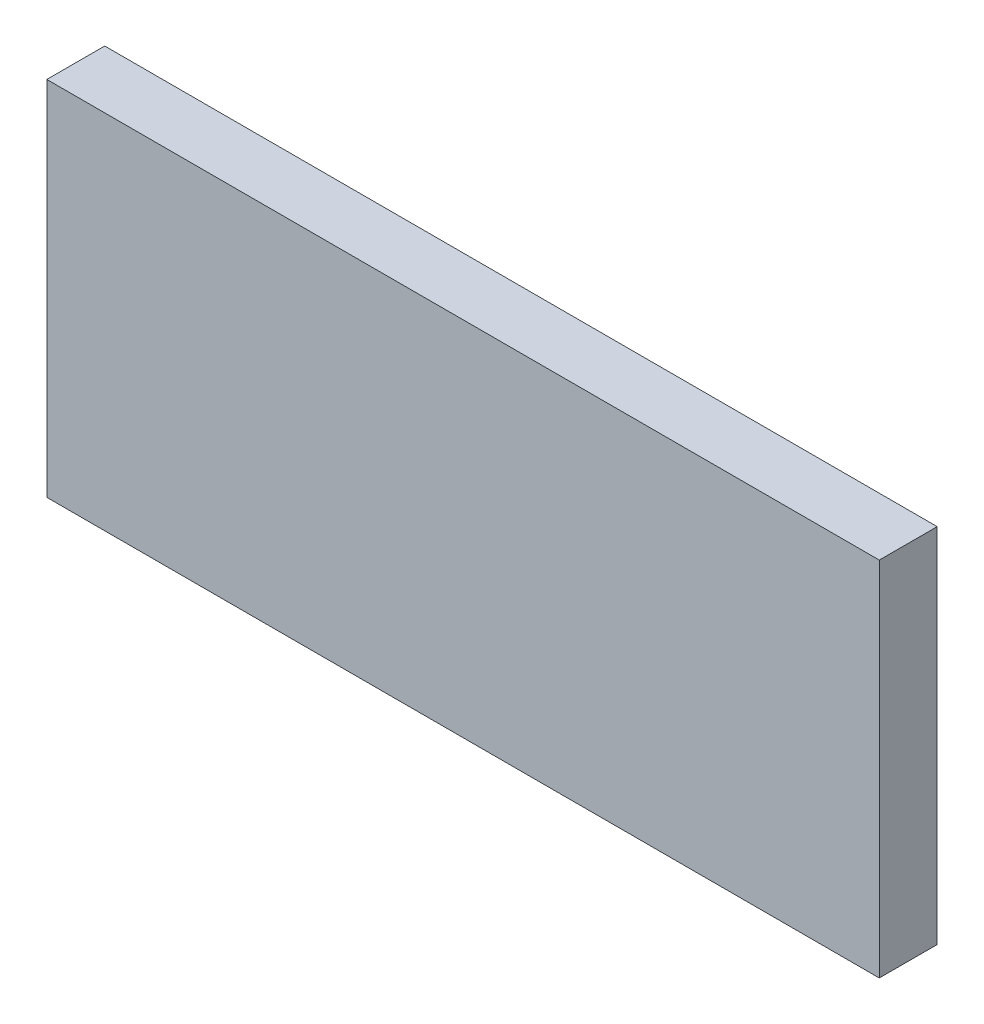
ISO-10303-21;
HEADER;
FILE_DESCRIPTION(('STEP AP214'),'2;1');
FILE_NAME('part.step','',(''),(''),'','','');
FILE_SCHEMA(('AUTOMOTIVE_DESIGN { 1 0 10303 214 1 1 1 1 }'));
ENDSEC;
DATA;
#1=APPLICATION_CONTEXT('core data for automotive mechanical design processes');
#2=APPLICATION_PROTOCOL_DEFINITION('international standard','automotive_design',2000,#1);
#3=PRODUCT_CONTEXT('',#1,'mechanical');
#4=PRODUCT('Part','Part','',(#3));
#5=PRODUCT_RELATED_PRODUCT_CATEGORY('part','',(#4));
#6=PRODUCT_DEFINITION_FORMATION('','',#4);
#7=PRODUCT_DEFINITION_CONTEXT('part definition',#1,'design');
#8=PRODUCT_DEFINITION('design','',#6,#7);
#9=PRODUCT_DEFINITION_SHAPE('','',#8);
#10=(LENGTH_UNIT() NAMED_UNIT(*) SI_UNIT(.MILLI.,.METRE.));
#11=(NAMED_UNIT(*) PLANE_ANGLE_UNIT() SI_UNIT($,.RADIAN.));
#12=(NAMED_UNIT(*) SI_UNIT($,.STERADIAN.) SOLID_ANGLE_UNIT());
#13=UNCERTAINTY_MEASURE_WITH_UNIT(LENGTH_MEASURE(1.E-05),#10,'distance_accuracy_value','');
#14=(GEOMETRIC_REPRESENTATION_CONTEXT(3) GLOBAL_UNCERTAINTY_ASSIGNED_CONTEXT((#13)) GLOBAL_UNIT_ASSIGNED_CONTEXT((#10,
#11,#12)) REPRESENTATION_CONTEXT('',''));
#15=CARTESIAN_POINT('',(0.,0.,0.));
#16=DIRECTION('',(0.,0.,1.));
#17=DIRECTION('',(1.,0.,0.));
#18=AXIS2_PLACEMENT_3D('',#15,#16,#17);
#19=CARTESIAN_POINT('',(-115.,-50.,16.));
#20=DIRECTION('',(1.,0.,0.));
#21=DIRECTION('',(0.,0.,-1.));
#22=AXIS2_PLACEMENT_3D('',#19,#20,#21);
#23=PLANE('',#22);
#24=DIRECTION('',(0.,-1.,0.));
#25=VECTOR('',#24,1.);
#26=CARTESIAN_POINT('',(-115.,-50.,0.));
#27=LINE('',#26,#25);
#28=CARTESIAN_POINT('',(-115.,50.,0.));
#29=VERTEX_POINT('',#28);
#30=CARTESIAN_POINT('',(-115.,-50.,0.));
#31=VERTEX_POINT('',#30);
#32=EDGE_CURVE('E98',#29,#31,#27,.T.);
#33=ORIENTED_EDGE('',*,*,#32,.T.);
#34=DIRECTION('',(0.,0.,-1.));
#35=VECTOR('',#34,1.);
#36=CARTESIAN_POINT('',(-115.,-50.,16.));
#37=LINE('',#36,#35);
#38=CARTESIAN_POINT('',(-115.,-50.,16.));
#39=VERTEX_POINT('',#38);
#40=EDGE_CURVE('E11',#39,#31,#37,.T.);
#41=ORIENTED_EDGE('',*,*,#40,.F.);
#42=DIRECTION('',(0.,-1.,0.));
#43=VECTOR('',#42,1.);
#44=CARTESIAN_POINT('',(-115.,-50.,16.));
#45=LINE('',#44,#43);
#46=CARTESIAN_POINT('',(-115.,50.,16.));
#47=VERTEX_POINT('',#46);
#48=EDGE_CURVE('E86',#47,#39,#45,.T.);
#49=ORIENTED_EDGE('',*,*,#48,.F.);
#50=DIRECTION('',(0.,0.,-1.));
#51=VECTOR('',#50,1.);
#52=CARTESIAN_POINT('',(-115.,50.,16.));
#53=LINE('',#52,#51);
#54=EDGE_CURVE('E94',#47,#29,#53,.T.);
#55=ORIENTED_EDGE('',*,*,#54,.T.);
#56=EDGE_LOOP('',(#33,#41,#49,#55));
#57=FACE_BOUND('',#56,.T.);
#58=ADVANCED_FACE('F35',(#57),#23,.F.);
#59=CARTESIAN_POINT('',(115.,-50.,16.));
#60=DIRECTION('',(0.,1.,0.));
#61=DIRECTION('',(-1.,0.,0.));
#62=AXIS2_PLACEMENT_3D('',#59,#60,#61);
#63=PLANE('',#62);
#64=DIRECTION('',(1.,0.,0.));
#65=VECTOR('',#64,1.);
#66=CARTESIAN_POINT('',(115.,-50.,0.));
#67=LINE('',#66,#65);
#68=CARTESIAN_POINT('',(115.,-50.,0.));
#69=VERTEX_POINT('',#68);
#70=EDGE_CURVE('E90',#31,#69,#67,.T.);
#71=ORIENTED_EDGE('',*,*,#70,.T.);
#72=DIRECTION('',(0.,0.,-1.));
#73=VECTOR('',#72,1.);
#74=CARTESIAN_POINT('',(115.,-50.,16.));
#75=LINE('',#74,#73);
#76=CARTESIAN_POINT('',(115.,-50.,16.));
#77=VERTEX_POINT('',#76);
#78=EDGE_CURVE('E43',#77,#69,#75,.T.);
#79=ORIENTED_EDGE('',*,*,#78,.F.);
#80=DIRECTION('',(1.,0.,0.));
#81=VECTOR('',#80,1.);
#82=CARTESIAN_POINT('',(115.,-50.,16.));
#83=LINE('',#82,#81);
#84=EDGE_CURVE('E81',#39,#77,#83,.T.);
#85=ORIENTED_EDGE('',*,*,#84,.F.);
#86=ORIENTED_EDGE('',*,*,#40,.T.);
#87=EDGE_LOOP('',(#71,#79,#85,#86));
#88=FACE_BOUND('',#87,.T.);
#89=ADVANCED_FACE('F89',(#88),#63,.F.);
#90=CARTESIAN_POINT('',(115.,-50.,16.));
#91=DIRECTION('',(-1.,0.,0.));
#92=DIRECTION('',(0.,0.,1.));
#93=AXIS2_PLACEMENT_3D('',#90,#91,#92);
#94=PLANE('',#93);
#95=DIRECTION('',(0.,1.,0.));
#96=VECTOR('',#95,1.);
#97=CARTESIAN_POINT('',(115.,-50.,0.));
#98=LINE('',#97,#96);
#99=CARTESIAN_POINT('',(115.,50.,0.));
#100=VERTEX_POINT('',#99);
#101=EDGE_CURVE('E68',#69,#100,#98,.T.);
#102=ORIENTED_EDGE('',*,*,#101,.T.);
#103=DIRECTION('',(0.,0.,-1.));
#104=VECTOR('',#103,1.);
#105=CARTESIAN_POINT('',(115.,50.,16.));
#106=LINE('',#105,#104);
#107=CARTESIAN_POINT('',(115.,50.,16.));
#108=VERTEX_POINT('',#107);
#109=EDGE_CURVE('E91',#108,#100,#106,.T.);
#110=ORIENTED_EDGE('',*,*,#109,.F.);
#111=DIRECTION('',(0.,1.,0.));
#112=VECTOR('',#111,1.);
#113=CARTESIAN_POINT('',(115.,-50.,16.));
#114=LINE('',#113,#112);
#115=EDGE_CURVE('E84',#77,#108,#114,.T.);
#116=ORIENTED_EDGE('',*,*,#115,.F.);
#117=ORIENTED_EDGE('',*,*,#78,.T.);
#118=EDGE_LOOP('',(#102,#110,#116,#117));
#119=FACE_BOUND('',#118,.T.);
#120=ADVANCED_FACE('F92',(#119),#94,.F.);
#121=CARTESIAN_POINT('',(115.,50.,16.));
#122=DIRECTION('',(0.,-1.,0.));
#123=DIRECTION('',(1.,0.,0.));
#124=AXIS2_PLACEMENT_3D('',#121,#122,#123);
#125=PLANE('',#124);
#126=DIRECTION('',(-1.,0.,0.));
#127=VECTOR('',#126,1.);
#128=CARTESIAN_POINT('',(115.,50.,0.));
#129=LINE('',#128,#127);
#130=EDGE_CURVE('E74',#100,#29,#129,.T.);
#131=ORIENTED_EDGE('',*,*,#130,.T.);
#132=ORIENTED_EDGE('',*,*,#54,.F.);
#133=DIRECTION('',(-1.,0.,0.));
#134=VECTOR('',#133,1.);
#135=CARTESIAN_POINT('',(115.,50.,16.));
#136=LINE('',#135,#134);
#137=EDGE_CURVE('E51',#108,#47,#136,.T.);
#138=ORIENTED_EDGE('',*,*,#137,.F.);
#139=ORIENTED_EDGE('',*,*,#109,.T.);
#140=EDGE_LOOP('',(#131,#132,#138,#139));
#141=FACE_BOUND('',#140,.T.);
#142=ADVANCED_FACE('F105',(#141),#125,.F.);
#143=CARTESIAN_POINT('',(0.,0.,16.));
#144=DIRECTION('',(0.,0.,1.));
#145=DIRECTION('',(1.,0.,0.));
#146=AXIS2_PLACEMENT_3D('',#143,#144,#145);
#147=PLANE('',#146);
#148=ORIENTED_EDGE('',*,*,#48,.T.);
#149=ORIENTED_EDGE('',*,*,#84,.T.);
#150=ORIENTED_EDGE('',*,*,#115,.T.);
#151=ORIENTED_EDGE('',*,*,#137,.T.);
#152=EDGE_LOOP('',(#148,#149,#150,#151));
#153=FACE_BOUND('',#152,.T.);
#154=ADVANCED_FACE('F82',(#153),#147,.T.);
#155=CARTESIAN_POINT('',(0.,0.,0.));
#156=DIRECTION('',(0.,0.,1.));
#157=DIRECTION('',(1.,0.,0.));
#158=AXIS2_PLACEMENT_3D('',#155,#156,#157);
#159=PLANE('',#158);
#160=ORIENTED_EDGE('',*,*,#32,.F.);
#161=ORIENTED_EDGE('',*,*,#130,.F.);
#162=ORIENTED_EDGE('',*,*,#101,.F.);
#163=ORIENTED_EDGE('',*,*,#70,.F.);
#164=EDGE_LOOP('',(#160,#161,#162,#163));
#165=FACE_BOUND('',#164,.T.);
#166=ADVANCED_FACE('F108',(#165),#159,.F.);
#167=CLOSED_SHELL('',(#58,#89,#120,#142,#154,#166));
#168=MANIFOLD_SOLID_BREP('B2',#167);
#169=ADVANCED_BREP_SHAPE_REPRESENTATION('',(#18,#168),#14);
#170=SHAPE_DEFINITION_REPRESENTATION(#9,#169);
ENDSEC;
END-ISO-10303-21;
